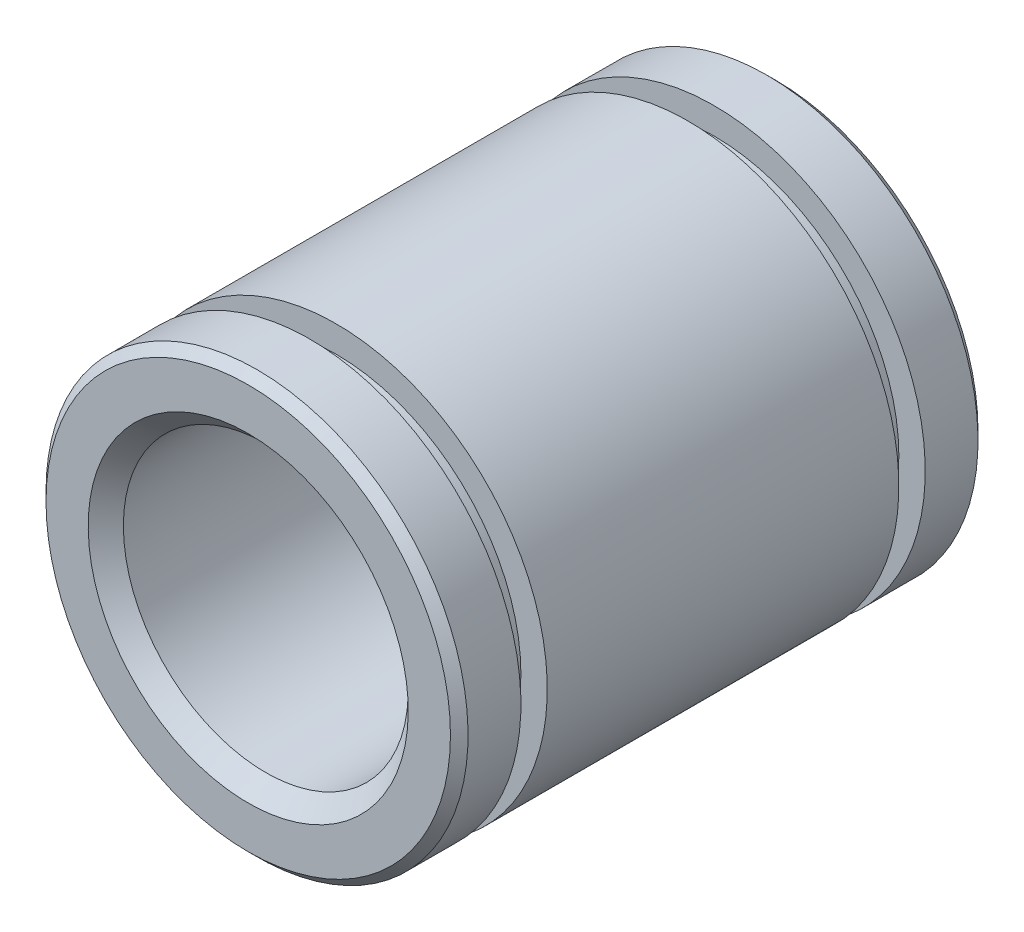
ISO-10303-21;
HEADER;
FILE_DESCRIPTION(('STEP AP214'),'2;1');
FILE_NAME('part.step','',(''),(''),'','','');
FILE_SCHEMA(('AUTOMOTIVE_DESIGN { 1 0 10303 214 1 1 1 1 }'));
ENDSEC;
DATA;
#1=APPLICATION_CONTEXT('core data for automotive mechanical design processes');
#2=APPLICATION_PROTOCOL_DEFINITION('international standard','automotive_design',2000,#1);
#3=PRODUCT_CONTEXT('',#1,'mechanical');
#4=PRODUCT('Part','Part','',(#3));
#5=PRODUCT_RELATED_PRODUCT_CATEGORY('part','',(#4));
#6=PRODUCT_DEFINITION_FORMATION('','',#4);
#7=PRODUCT_DEFINITION_CONTEXT('part definition',#1,'design');
#8=PRODUCT_DEFINITION('design','',#6,#7);
#9=PRODUCT_DEFINITION_SHAPE('','',#8);
#10=(LENGTH_UNIT() NAMED_UNIT(*) SI_UNIT(.MILLI.,.METRE.));
#11=(NAMED_UNIT(*) PLANE_ANGLE_UNIT() SI_UNIT($,.RADIAN.));
#12=(NAMED_UNIT(*) SI_UNIT($,.STERADIAN.) SOLID_ANGLE_UNIT());
#13=UNCERTAINTY_MEASURE_WITH_UNIT(LENGTH_MEASURE(1.E-05),#10,'distance_accuracy_value','');
#14=(GEOMETRIC_REPRESENTATION_CONTEXT(3) GLOBAL_UNCERTAINTY_ASSIGNED_CONTEXT((#13)) GLOBAL_UNIT_ASSIGNED_CONTEXT((#10,
#11,#12)) REPRESENTATION_CONTEXT('',''));
#15=CARTESIAN_POINT('',(0.,0.,0.));
#16=DIRECTION('',(0.,0.,1.));
#17=DIRECTION('',(1.,0.,0.));
#18=AXIS2_PLACEMENT_3D('',#15,#16,#17);
#19=CARTESIAN_POINT('',(0.,0.,26.4932583802));
#20=DIRECTION('',(0.,0.,-1.));
#21=DIRECTION('',(0.,-1.,0.));
#22=AXIS2_PLACEMENT_3D('',#19,#20,#21);
#23=PLANE('',#22);
#24=CARTESIAN_POINT('',(0.,0.,26.4932583802));
#25=DIRECTION('',(0.,0.,-1.));
#26=DIRECTION('',(0.,-1.,0.));
#27=AXIS2_PLACEMENT_3D('',#24,#25,#26);
#28=CIRCLE('',#27,10.5);
#29=CARTESIAN_POINT('',(0.,10.5,26.4932583802));
#30=VERTEX_POINT('',#29);
#31=EDGE_CURVE('E11',#30,#30,#28,.T.);
#32=ORIENTED_EDGE('',*,*,#31,.F.);
#33=EDGE_LOOP('',(#32));
#34=FACE_BOUND('',#33,.T.);
#35=CARTESIAN_POINT('',(0.,0.,26.4932583802));
#36=DIRECTION('',(0.,0.,-1.));
#37=DIRECTION('',(-1.,0.,0.));
#38=AXIS2_PLACEMENT_3D('',#35,#36,#37);
#39=CIRCLE('',#38,12.);
#40=CARTESIAN_POINT('',(-12.,0.,26.4932583802));
#41=VERTEX_POINT('',#40);
#42=EDGE_CURVE('E161',#41,#41,#39,.T.);
#43=ORIENTED_EDGE('',*,*,#42,.T.);
#44=EDGE_LOOP('',(#43));
#45=FACE_BOUND('',#44,.T.);
#46=ADVANCED_FACE('F17',(#34,#45),#23,.T.);
#47=CARTESIAN_POINT('',(0.,0.,26.5682583802));
#48=DIRECTION('',(0.,0.,-1.));
#49=DIRECTION('',(0.,-1.,0.));
#50=AXIS2_PLACEMENT_3D('',#47,#48,#49);
#51=CYLINDRICAL_SURFACE('',#50,10.5);
#52=CARTESIAN_POINT('',(0.,0.,24.9932583802));
#53=DIRECTION('',(0.,0.,1.));
#54=DIRECTION('',(0.,-1.,0.));
#55=AXIS2_PLACEMENT_3D('',#52,#53,#54);
#56=CIRCLE('',#55,10.5);
#57=CARTESIAN_POINT('',(0.,10.5,24.9932583802));
#58=VERTEX_POINT('',#57);
#59=EDGE_CURVE('E135',#58,#58,#56,.T.);
#60=ORIENTED_EDGE('',*,*,#59,.T.);
#61=DIRECTION('',(0.,0.,1.));
#62=VECTOR('',#61,1.);
#63=CARTESIAN_POINT('',(0.,10.5,26.5682583802));
#64=LINE('',#63,#62);
#65=EDGE_CURVE('E28',#58,#30,#64,.T.);
#66=ORIENTED_EDGE('',*,*,#65,.T.);
#67=ORIENTED_EDGE('',*,*,#31,.T.);
#68=ORIENTED_EDGE('',*,*,#65,.F.);
#69=EDGE_LOOP('',(#60,#66,#67,#68));
#70=FACE_BOUND('',#69,.T.);
#71=ADVANCED_FACE('F208',(#70),#51,.T.);
#72=CARTESIAN_POINT('',(0.,0.,24.9932583802));
#73=DIRECTION('',(0.,0.,-1.));
#74=DIRECTION('',(0.,-1.,0.));
#75=AXIS2_PLACEMENT_3D('',#72,#73,#74);
#76=PLANE('',#75);
#77=ORIENTED_EDGE('',*,*,#59,.F.);
#78=EDGE_LOOP('',(#77));
#79=FACE_BOUND('',#78,.T.);
#80=CARTESIAN_POINT('',(0.,0.,24.9932583802));
#81=DIRECTION('',(0.,0.,1.));
#82=DIRECTION('',(1.,0.,0.));
#83=AXIS2_PLACEMENT_3D('',#80,#81,#82);
#84=CIRCLE('',#83,12.);
#85=CARTESIAN_POINT('',(-12.,0.,24.9932583802));
#86=VERTEX_POINT('',#85);
#87=EDGE_CURVE('E141',#86,#86,#84,.T.);
#88=ORIENTED_EDGE('',*,*,#87,.T.);
#89=EDGE_LOOP('',(#88));
#90=FACE_BOUND('',#89,.T.);
#91=ADVANCED_FACE('F211',(#79,#90),#76,.F.);
#92=CARTESIAN_POINT('',(0.,0.,0.2499999999277));
#93=DIRECTION('',(0.,0.,1.));
#94=DIRECTION('',(0.,-1.,0.));
#95=AXIS2_PLACEMENT_3D('',#92,#93,#94);
#96=CONICAL_SURFACE('',#95,11.74999999993,0.785398163397448);
#97=CARTESIAN_POINT('',(0.,0.,0.5));
#98=DIRECTION('',(0.,0.,-1.));
#99=DIRECTION('',(-1.,0.,0.));
#100=AXIS2_PLACEMENT_3D('',#97,#98,#99);
#101=CIRCLE('',#100,12.);
#102=CARTESIAN_POINT('',(-12.,0.,0.5));
#103=VERTEX_POINT('',#102);
#104=CARTESIAN_POINT('',(0.,12.0000000000012,0.499999999998868));
#105=VERTEX_POINT('',#104);
#106=EDGE_CURVE('E138',#103,#105,#101,.T.);
#107=ORIENTED_EDGE('',*,*,#106,.T.);
#108=DIRECTION('',(0.,-0.707106781186548,-0.707106781186548));
#109=VECTOR('',#108,1.);
#110=CARTESIAN_POINT('',(0.,11.74999999993,0.2499999999277));
#111=LINE('',#110,#109);
#112=CARTESIAN_POINT('',(0.,11.5000000000012,-1.16701787122864E-12));
#113=VERTEX_POINT('',#112);
#114=EDGE_CURVE('E55',#105,#113,#111,.T.);
#115=ORIENTED_EDGE('',*,*,#114,.T.);
#116=CARTESIAN_POINT('',(0.,0.,0.));
#117=DIRECTION('',(0.,0.,-1.));
#118=DIRECTION('',(-1.,0.,0.));
#119=AXIS2_PLACEMENT_3D('',#116,#117,#118);
#120=CIRCLE('',#119,11.5);
#121=EDGE_CURVE('E21',#113,#113,#120,.T.);
#122=ORIENTED_EDGE('',*,*,#121,.F.);
#123=ORIENTED_EDGE('',*,*,#114,.F.);
#124=CARTESIAN_POINT('',(0.,0.,0.5));
#125=DIRECTION('',(0.,0.,-1.));
#126=DIRECTION('',(-1.,0.,0.));
#127=AXIS2_PLACEMENT_3D('',#124,#125,#126);
#128=CIRCLE('',#127,12.);
#129=EDGE_CURVE('E132',#105,#103,#128,.T.);
#130=ORIENTED_EDGE('',*,*,#129,.T.);
#131=EDGE_LOOP('',(#107,#115,#122,#123,#130));
#132=FACE_BOUND('',#131,.T.);
#133=ADVANCED_FACE('F130',(#132),#96,.T.);
#134=CARTESIAN_POINT('',(0.,0.,5.));
#135=DIRECTION('',(0.,0.,1.));
#136=DIRECTION('',(1.,0.,0.));
#137=AXIS2_PLACEMENT_3D('',#134,#135,#136);
#138=PLANE('',#137);
#139=CARTESIAN_POINT('',(0.,0.,5.));
#140=DIRECTION('',(0.,0.,-1.));
#141=DIRECTION('',(0.,-1.,0.));
#142=AXIS2_PLACEMENT_3D('',#139,#140,#141);
#143=CIRCLE('',#142,10.5);
#144=CARTESIAN_POINT('',(0.,-10.5,5.));
#145=VERTEX_POINT('',#144);
#146=EDGE_CURVE('E180',#145,#145,#143,.T.);
#147=ORIENTED_EDGE('',*,*,#146,.F.);
#148=EDGE_LOOP('',(#147));
#149=FACE_BOUND('',#148,.T.);
#150=CARTESIAN_POINT('',(0.,0.,5.));
#151=DIRECTION('',(0.,0.,-1.));
#152=DIRECTION('',(-1.,0.,0.));
#153=AXIS2_PLACEMENT_3D('',#150,#151,#152);
#154=CIRCLE('',#153,12.);
#155=CARTESIAN_POINT('',(-12.,0.,5.));
#156=VERTEX_POINT('',#155);
#157=EDGE_CURVE('E162',#156,#156,#154,.T.);
#158=ORIENTED_EDGE('',*,*,#157,.T.);
#159=EDGE_LOOP('',(#158));
#160=FACE_BOUND('',#159,.T.);
#161=ADVANCED_FACE('F286',(#149,#160),#138,.F.);
#162=CARTESIAN_POINT('',(0.,0.,0.));
#163=DIRECTION('',(0.,0.,1.));
#164=DIRECTION('',(0.,1.,0.));
#165=AXIS2_PLACEMENT_3D('',#162,#163,#164);
#166=CYLINDRICAL_SURFACE('',#165,10.5);
#167=ORIENTED_EDGE('',*,*,#146,.T.);
#168=DIRECTION('',(0.,0.,-1.));
#169=VECTOR('',#168,1.);
#170=CARTESIAN_POINT('',(0.,-10.5,0.));
#171=LINE('',#170,#169);
#172=CARTESIAN_POINT('',(0.,-10.5,3.5));
#173=VERTEX_POINT('',#172);
#174=EDGE_CURVE('E136',#145,#173,#171,.T.);
#175=ORIENTED_EDGE('',*,*,#174,.T.);
#176=CARTESIAN_POINT('',(0.,0.,3.5));
#177=DIRECTION('',(0.,0.,1.));
#178=DIRECTION('',(0.,-1.,0.));
#179=AXIS2_PLACEMENT_3D('',#176,#177,#178);
#180=CIRCLE('',#179,10.5);
#181=EDGE_CURVE('E173',#173,#173,#180,.T.);
#182=ORIENTED_EDGE('',*,*,#181,.T.);
#183=ORIENTED_EDGE('',*,*,#174,.F.);
#184=EDGE_LOOP('',(#167,#175,#182,#183));
#185=FACE_BOUND('',#184,.T.);
#186=ADVANCED_FACE('F267',(#185),#166,.T.);
#187=CARTESIAN_POINT('',(0.,0.,3.5));
#188=DIRECTION('',(0.,0.,1.));
#189=DIRECTION('',(1.,0.,0.));
#190=AXIS2_PLACEMENT_3D('',#187,#188,#189);
#191=PLANE('',#190);
#192=ORIENTED_EDGE('',*,*,#181,.F.);
#193=EDGE_LOOP('',(#192));
#194=FACE_BOUND('',#193,.T.);
#195=CARTESIAN_POINT('',(0.,0.,3.5));
#196=DIRECTION('',(0.,0.,1.));
#197=DIRECTION('',(1.,0.,0.));
#198=AXIS2_PLACEMENT_3D('',#195,#196,#197);
#199=CIRCLE('',#198,12.);
#200=CARTESIAN_POINT('',(-12.,0.,3.5));
#201=VERTEX_POINT('',#200);
#202=EDGE_CURVE('E152',#201,#201,#199,.T.);
#203=ORIENTED_EDGE('',*,*,#202,.T.);
#204=EDGE_LOOP('',(#203));
#205=FACE_BOUND('',#204,.T.);
#206=ADVANCED_FACE('F260',(#194,#205),#191,.T.);
#207=CARTESIAN_POINT('',(0.,0.,0.));
#208=DIRECTION('',(0.,0.,1.));
#209=DIRECTION('',(1.,0.,0.));
#210=AXIS2_PLACEMENT_3D('',#207,#208,#209);
#211=CYLINDRICAL_SURFACE('',#210,12.);
#212=CARTESIAN_POINT('',(0.,0.,29.5));
#213=DIRECTION('',(0.,0.,1.));
#214=DIRECTION('',(-1.,0.,0.));
#215=AXIS2_PLACEMENT_3D('',#212,#213,#214);
#216=CIRCLE('',#215,12.);
#217=CARTESIAN_POINT('',(-12.,0.,29.5));
#218=VERTEX_POINT('',#217);
#219=CARTESIAN_POINT('',(0.,12.,29.5));
#220=VERTEX_POINT('',#219);
#221=EDGE_CURVE('E195',#218,#220,#216,.T.);
#222=ORIENTED_EDGE('',*,*,#221,.F.);
#223=DIRECTION('',(0.,0.,-1.));
#224=VECTOR('',#223,1.);
#225=CARTESIAN_POINT('',(-12.,0.,0.));
#226=LINE('',#225,#224);
#227=EDGE_CURVE('E157',#218,#41,#226,.T.);
#228=ORIENTED_EDGE('',*,*,#227,.T.);
#229=ORIENTED_EDGE('',*,*,#42,.F.);
#230=ORIENTED_EDGE('',*,*,#227,.F.);
#231=CARTESIAN_POINT('',(0.,0.,29.5));
#232=DIRECTION('',(0.,0.,1.));
#233=DIRECTION('',(-1.,0.,0.));
#234=AXIS2_PLACEMENT_3D('',#231,#232,#233);
#235=CIRCLE('',#234,12.);
#236=EDGE_CURVE('E227',#220,#218,#235,.T.);
#237=ORIENTED_EDGE('',*,*,#236,.F.);
#238=EDGE_LOOP('',(#222,#228,#229,#230,#237));
#239=FACE_BOUND('',#238,.T.);
#240=ADVANCED_FACE('F258',(#239),#211,.T.);
#241=CARTESIAN_POINT('',(0.,0.,0.));
#242=DIRECTION('',(0.,0.,1.));
#243=DIRECTION('',(1.,0.,0.));
#244=AXIS2_PLACEMENT_3D('',#241,#242,#243);
#245=CYLINDRICAL_SURFACE('',#244,12.);
#246=ORIENTED_EDGE('',*,*,#87,.F.);
#247=DIRECTION('',(0.,0.,-1.));
#248=VECTOR('',#247,1.);
#249=CARTESIAN_POINT('',(-12.,0.,0.));
#250=LINE('',#249,#248);
#251=EDGE_CURVE('E167',#86,#156,#250,.T.);
#252=ORIENTED_EDGE('',*,*,#251,.T.);
#253=ORIENTED_EDGE('',*,*,#157,.F.);
#254=ORIENTED_EDGE('',*,*,#251,.F.);
#255=EDGE_LOOP('',(#246,#252,#253,#254));
#256=FACE_BOUND('',#255,.T.);
#257=ADVANCED_FACE('F19',(#256),#245,.T.);
#258=CARTESIAN_POINT('',(0.,0.,0.));
#259=DIRECTION('',(0.,0.,1.));
#260=DIRECTION('',(1.,0.,0.));
#261=AXIS2_PLACEMENT_3D('',#258,#259,#260);
#262=CYLINDRICAL_SURFACE('',#261,12.);
#263=ORIENTED_EDGE('',*,*,#202,.F.);
#264=DIRECTION('',(0.,0.,-1.));
#265=VECTOR('',#264,1.);
#266=CARTESIAN_POINT('',(-12.,0.,0.));
#267=LINE('',#266,#265);
#268=EDGE_CURVE('E145',#201,#103,#267,.T.);
#269=ORIENTED_EDGE('',*,*,#268,.T.);
#270=ORIENTED_EDGE('',*,*,#129,.F.);
#271=ORIENTED_EDGE('',*,*,#106,.F.);
#272=ORIENTED_EDGE('',*,*,#268,.F.);
#273=EDGE_LOOP('',(#263,#269,#270,#271,#272));
#274=FACE_BOUND('',#273,.T.);
#275=ADVANCED_FACE('F144',(#274),#262,.T.);
#276=CARTESIAN_POINT('',(0.,0.,29.75000000007));
#277=DIRECTION('',(0.,0.,-1.));
#278=DIRECTION('',(0.,-1.,0.));
#279=AXIS2_PLACEMENT_3D('',#276,#277,#278);
#280=CONICAL_SURFACE('',#279,11.74999999993,0.785398163397448);
#281=ORIENTED_EDGE('',*,*,#221,.T.);
#282=DIRECTION('',(0.,-0.707106781186548,0.707106781186548));
#283=VECTOR('',#282,1.);
#284=CARTESIAN_POINT('',(0.,11.74999999993,29.75000000007));
#285=LINE('',#284,#283);
#286=CARTESIAN_POINT('',(0.,11.5,30.));
#287=VERTEX_POINT('',#286);
#288=EDGE_CURVE('E199',#220,#287,#285,.T.);
#289=ORIENTED_EDGE('',*,*,#288,.T.);
#290=CARTESIAN_POINT('',(0.,0.,30.));
#291=DIRECTION('',(0.,0.,1.));
#292=DIRECTION('',(-1.,0.,0.));
#293=AXIS2_PLACEMENT_3D('',#290,#291,#292);
#294=CIRCLE('',#293,11.5);
#295=EDGE_CURVE('E200',#287,#287,#294,.T.);
#296=ORIENTED_EDGE('',*,*,#295,.F.);
#297=ORIENTED_EDGE('',*,*,#288,.F.);
#298=ORIENTED_EDGE('',*,*,#236,.T.);
#299=EDGE_LOOP('',(#281,#289,#296,#297,#298));
#300=FACE_BOUND('',#299,.T.);
#301=ADVANCED_FACE('F254',(#300),#280,.T.);
#302=CARTESIAN_POINT('',(0.,0.,30.));
#303=DIRECTION('',(0.,0.,1.));
#304=DIRECTION('',(1.,0.,0.));
#305=AXIS2_PLACEMENT_3D('',#302,#303,#304);
#306=PLANE('',#305);
#307=CARTESIAN_POINT('',(0.,0.,30.));
#308=DIRECTION('',(0.,0.,-1.));
#309=DIRECTION('',(-1.,0.,0.));
#310=AXIS2_PLACEMENT_3D('',#307,#308,#309);
#311=CIRCLE('',#310,9.1);
#312=CARTESIAN_POINT('',(0.,9.0999999999985,30.0000000000015));
#313=VERTEX_POINT('',#312);
#314=EDGE_CURVE('E156',#313,#313,#311,.T.);
#315=ORIENTED_EDGE('',*,*,#314,.T.);
#316=EDGE_LOOP('',(#315));
#317=FACE_BOUND('',#316,.T.);
#318=ORIENTED_EDGE('',*,*,#295,.T.);
#319=EDGE_LOOP('',(#318));
#320=FACE_BOUND('',#319,.T.);
#321=ADVANCED_FACE('F282',(#317,#320),#306,.T.);
#322=CARTESIAN_POINT('',(0.,0.,29.49999999979));
#323=DIRECTION('',(0.,0.,1.));
#324=DIRECTION('',(0.,-1.,0.));
#325=AXIS2_PLACEMENT_3D('',#322,#323,#324);
#326=CONICAL_SURFACE('',#325,8.599999999787,0.785398163397448);
#327=CARTESIAN_POINT('',(0.,0.,29.));
#328=DIRECTION('',(0.,0.,-1.));
#329=DIRECTION('',(-1.,0.,0.));
#330=AXIS2_PLACEMENT_3D('',#327,#328,#329);
#331=CIRCLE('',#330,8.1);
#332=CARTESIAN_POINT('',(0.,8.0999999999985,29.0000000000015));
#333=VERTEX_POINT('',#332);
#334=CARTESIAN_POINT('',(-8.1,0.,29.));
#335=VERTEX_POINT('',#334);
#336=EDGE_CURVE('E170',#333,#335,#331,.T.);
#337=ORIENTED_EDGE('',*,*,#336,.T.);
#338=CARTESIAN_POINT('',(0.,0.,29.));
#339=DIRECTION('',(0.,0.,-1.));
#340=DIRECTION('',(-1.,0.,0.));
#341=AXIS2_PLACEMENT_3D('',#338,#339,#340);
#342=CIRCLE('',#341,8.1);
#343=EDGE_CURVE('E201',#335,#333,#342,.T.);
#344=ORIENTED_EDGE('',*,*,#343,.T.);
#345=DIRECTION('',(0.,0.707106781186548,0.707106781186548));
#346=VECTOR('',#345,1.);
#347=CARTESIAN_POINT('',(0.,8.599999999787,29.49999999979));
#348=LINE('',#347,#346);
#349=EDGE_CURVE('E191',#333,#313,#348,.T.);
#350=ORIENTED_EDGE('',*,*,#349,.T.);
#351=ORIENTED_EDGE('',*,*,#314,.F.);
#352=ORIENTED_EDGE('',*,*,#349,.F.);
#353=EDGE_LOOP('',(#337,#344,#350,#351,#352));
#354=FACE_BOUND('',#353,.T.);
#355=ADVANCED_FACE('F284',(#354),#326,.F.);
#356=CARTESIAN_POINT('',(0.,0.,0.));
#357=DIRECTION('',(0.,0.,1.));
#358=DIRECTION('',(1.,0.,0.));
#359=AXIS2_PLACEMENT_3D('',#356,#357,#358);
#360=CYLINDRICAL_SURFACE('',#359,8.1);
#361=CARTESIAN_POINT('',(0.,0.,1.));
#362=DIRECTION('',(0.,0.,1.));
#363=DIRECTION('',(-1.,0.,0.));
#364=AXIS2_PLACEMENT_3D('',#361,#362,#363);
#365=CIRCLE('',#364,8.1);
#366=CARTESIAN_POINT('',(-8.1,0.,1.));
#367=VERTEX_POINT('',#366);
#368=CARTESIAN_POINT('',(0.,8.10000000000015,1.00000000000015));
#369=VERTEX_POINT('',#368);
#370=EDGE_CURVE('E233',#367,#369,#365,.T.);
#371=ORIENTED_EDGE('',*,*,#370,.F.);
#372=DIRECTION('',(0.,0.,1.));
#373=VECTOR('',#372,1.);
#374=CARTESIAN_POINT('',(-8.1,0.,0.));
#375=LINE('',#374,#373);
#376=EDGE_CURVE('E78',#367,#335,#375,.T.);
#377=ORIENTED_EDGE('',*,*,#376,.T.);
#378=ORIENTED_EDGE('',*,*,#336,.F.);
#379=ORIENTED_EDGE('',*,*,#343,.F.);
#380=ORIENTED_EDGE('',*,*,#376,.F.);
#381=CARTESIAN_POINT('',(0.,0.,1.));
#382=DIRECTION('',(0.,0.,1.));
#383=DIRECTION('',(-1.,0.,0.));
#384=AXIS2_PLACEMENT_3D('',#381,#382,#383);
#385=CIRCLE('',#384,8.1);
#386=EDGE_CURVE('E171',#369,#367,#385,.T.);
#387=ORIENTED_EDGE('',*,*,#386,.F.);
#388=EDGE_LOOP('',(#371,#377,#378,#379,#380,#387));
#389=FACE_BOUND('',#388,.T.);
#390=ADVANCED_FACE('F299',(#389),#360,.F.);
#391=CARTESIAN_POINT('',(0.,0.,0.5000000002133));
#392=DIRECTION('',(0.,0.,-1.));
#393=DIRECTION('',(0.,-1.,0.));
#394=AXIS2_PLACEMENT_3D('',#391,#392,#393);
#395=CONICAL_SURFACE('',#394,8.599999999787,0.785398163397448);
#396=ORIENTED_EDGE('',*,*,#370,.T.);
#397=DIRECTION('',(0.,0.707106781186548,-0.707106781186548));
#398=VECTOR('',#397,1.);
#399=CARTESIAN_POINT('',(0.,8.599999999787,0.5000000002133));
#400=LINE('',#399,#398);
#401=CARTESIAN_POINT('',(0.,9.10000000000015,1.4960255256824E-13));
#402=VERTEX_POINT('',#401);
#403=EDGE_CURVE('E65',#369,#402,#400,.T.);
#404=ORIENTED_EDGE('',*,*,#403,.T.);
#405=CARTESIAN_POINT('',(0.,0.,0.));
#406=DIRECTION('',(0.,0.,1.));
#407=DIRECTION('',(-1.,0.,0.));
#408=AXIS2_PLACEMENT_3D('',#405,#406,#407);
#409=CIRCLE('',#408,9.1);
#410=EDGE_CURVE('E231',#402,#402,#409,.T.);
#411=ORIENTED_EDGE('',*,*,#410,.F.);
#412=ORIENTED_EDGE('',*,*,#403,.F.);
#413=ORIENTED_EDGE('',*,*,#386,.T.);
#414=EDGE_LOOP('',(#396,#404,#411,#412,#413));
#415=FACE_BOUND('',#414,.T.);
#416=ADVANCED_FACE('F301',(#415),#395,.F.);
#417=CARTESIAN_POINT('',(0.,0.,0.));
#418=DIRECTION('',(0.,0.,1.));
#419=DIRECTION('',(1.,0.,0.));
#420=AXIS2_PLACEMENT_3D('',#417,#418,#419);
#421=PLANE('',#420);
#422=ORIENTED_EDGE('',*,*,#410,.T.);
#423=EDGE_LOOP('',(#422));
#424=FACE_BOUND('',#423,.T.);
#425=ORIENTED_EDGE('',*,*,#121,.T.);
#426=EDGE_LOOP('',(#425));
#427=FACE_BOUND('',#426,.T.);
#428=ADVANCED_FACE('F303',(#424,#427),#421,.F.);
#429=CLOSED_SHELL('',(#46,#71,#91,#133,#161,#186,#206,#240,#257,#275,#301,#321,#355,#390,#416,#428));
#430=MANIFOLD_SOLID_BREP('B1',#429);
#431=ADVANCED_BREP_SHAPE_REPRESENTATION('',(#18,#430),#14);
#432=SHAPE_DEFINITION_REPRESENTATION(#9,#431);
ENDSEC;
END-ISO-10303-21;
